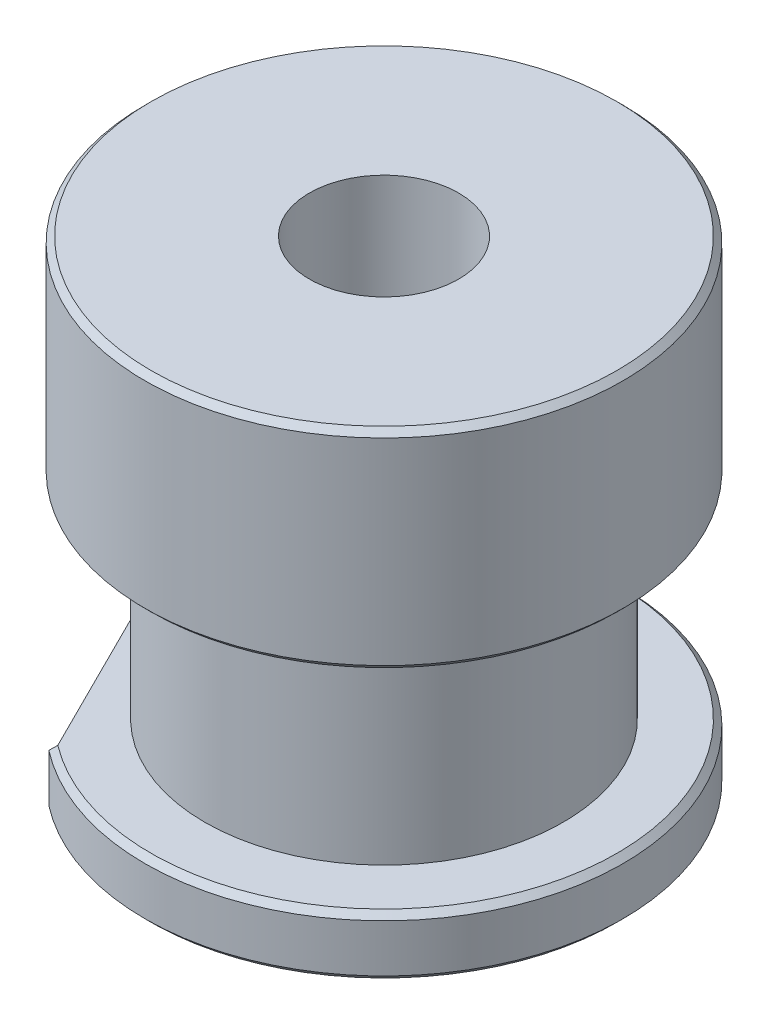
ISO-10303-21;
HEADER;
FILE_DESCRIPTION(('STEP AP214'),'2;1');
FILE_NAME('part.step','',(''),(''),'','','');
FILE_SCHEMA(('AUTOMOTIVE_DESIGN { 1 0 10303 214 1 1 1 1 }'));
ENDSEC;
DATA;
#1=APPLICATION_CONTEXT('core data for automotive mechanical design processes');
#2=APPLICATION_PROTOCOL_DEFINITION('international standard','automotive_design',2000,#1);
#3=PRODUCT_CONTEXT('',#1,'mechanical');
#4=PRODUCT('Part','Part','',(#3));
#5=PRODUCT_RELATED_PRODUCT_CATEGORY('part','',(#4));
#6=PRODUCT_DEFINITION_FORMATION('','',#4);
#7=PRODUCT_DEFINITION_CONTEXT('part definition',#1,'design');
#8=PRODUCT_DEFINITION('design','',#6,#7);
#9=PRODUCT_DEFINITION_SHAPE('','',#8);
#10=(LENGTH_UNIT() NAMED_UNIT(*) SI_UNIT(.MILLI.,.METRE.));
#11=(NAMED_UNIT(*) PLANE_ANGLE_UNIT() SI_UNIT($,.RADIAN.));
#12=(NAMED_UNIT(*) SI_UNIT($,.STERADIAN.) SOLID_ANGLE_UNIT());
#13=UNCERTAINTY_MEASURE_WITH_UNIT(LENGTH_MEASURE(1.E-05),#10,'distance_accuracy_value','');
#14=(GEOMETRIC_REPRESENTATION_CONTEXT(3) GLOBAL_UNCERTAINTY_ASSIGNED_CONTEXT((#13)) GLOBAL_UNIT_ASSIGNED_CONTEXT((#10,
#11,#12)) REPRESENTATION_CONTEXT('',''));
#15=CARTESIAN_POINT('',(0.,0.,0.));
#16=DIRECTION('',(0.,0.,1.));
#17=DIRECTION('',(1.,0.,0.));
#18=AXIS2_PLACEMENT_3D('',#15,#16,#17);
#19=CARTESIAN_POINT('',(0.,9.00000000000002,-3.55299123455666E-13));
#20=DIRECTION('',(0.,1.,-3.5615954629975E-13));
#21=DIRECTION('',(0.,3.5615954629975E-13,1.));
#22=AXIS2_PLACEMENT_3D('',#19,#20,#21);
#23=CYLINDRICAL_SURFACE('',#22,8.);
#24=CARTESIAN_POINT('',(0.,15.8,-2.77718403829397E-12));
#25=DIRECTION('',(0.,-1.,3.5615954629975E-13));
#26=DIRECTION('',(0.,-3.5615954629975E-13,-1.));
#27=AXIS2_PLACEMENT_3D('',#24,#25,#26);
#28=CIRCLE('',#27,8.);
#29=CARTESIAN_POINT('',(0.,15.7999999999972,-8.00000000000278));
#30=VERTEX_POINT('',#29);
#31=EDGE_CURVE('E162',#30,#30,#28,.T.);
#32=ORIENTED_EDGE('',*,*,#31,.T.);
#33=EDGE_LOOP('',(#32));
#34=FACE_BOUND('',#33,.T.);
#35=CARTESIAN_POINT('',(0.,9.20000000000003,-4.26531032715617E-13));
#36=DIRECTION('',(0.,-1.,3.5615954629975E-13));
#37=DIRECTION('',(0.,-3.5615954629975E-13,-1.));
#38=AXIS2_PLACEMENT_3D('',#35,#36,#37);
#39=CIRCLE('',#38,8.);
#40=CARTESIAN_POINT('',(0.,9.19999999999718,-8.00000000000043));
#41=VERTEX_POINT('',#40);
#42=EDGE_CURVE('E159',#41,#41,#39,.F.);
#43=ORIENTED_EDGE('',*,*,#42,.T.);
#44=EDGE_LOOP('',(#43));
#45=FACE_BOUND('',#44,.T.);
#46=ADVANCED_FACE('F36',(#34,#45),#23,.T.);
#47=CARTESIAN_POINT('',(0.,9.00000000000002,-3.55299123455666E-13));
#48=DIRECTION('',(0.,-1.,3.5615954629975E-13));
#49=DIRECTION('',(0.,-3.5615954629975E-13,-1.));
#50=AXIS2_PLACEMENT_3D('',#47,#48,#49);
#51=PLANE('',#50);
#52=CARTESIAN_POINT('',(0.,9.00000000000002,-3.55299123455666E-13));
#53=DIRECTION('',(0.,-1.,3.5615954629975E-13));
#54=DIRECTION('',(0.,-3.5615954629975E-13,-1.));
#55=AXIS2_PLACEMENT_3D('',#52,#53,#54);
#56=CIRCLE('',#55,7.79999999999999);
#57=CARTESIAN_POINT('',(0.,8.99999999999725,-7.80000000000035));
#58=VERTEX_POINT('',#57);
#59=EDGE_CURVE('E168',#58,#58,#56,.T.);
#60=ORIENTED_EDGE('',*,*,#59,.T.);
#61=EDGE_LOOP('',(#60));
#62=FACE_BOUND('',#61,.T.);
#63=CARTESIAN_POINT('',(0.,9.00000000000002,-3.55299123455666E-13));
#64=DIRECTION('',(0.,-1.,3.5615954629975E-13));
#65=DIRECTION('',(0.,-3.5615954629975E-13,-1.));
#66=AXIS2_PLACEMENT_3D('',#63,#64,#65);
#67=CIRCLE('',#66,6.);
#68=CARTESIAN_POINT('',(0.,8.99999999999789,-6.00000000000036));
#69=VERTEX_POINT('',#68);
#70=EDGE_CURVE('E156',#69,#69,#67,.T.);
#71=ORIENTED_EDGE('',*,*,#70,.F.);
#72=EDGE_LOOP('',(#71));
#73=FACE_BOUND('',#72,.T.);
#74=ADVANCED_FACE('F195',(#62,#73),#51,.T.);
#75=CARTESIAN_POINT('',(0.,16.,-2.84841594755392E-12));
#76=DIRECTION('',(0.,-1.,3.5615954629975E-13));
#77=DIRECTION('',(0.,-3.5615954629975E-13,-1.));
#78=AXIS2_PLACEMENT_3D('',#75,#76,#77);
#79=PLANE('',#78);
#80=CARTESIAN_POINT('',(0.,16.,-2.84841594755392E-12));
#81=DIRECTION('',(0.,-1.,3.5615954629975E-13));
#82=DIRECTION('',(0.,-3.5615954629975E-13,-1.));
#83=AXIS2_PLACEMENT_3D('',#80,#81,#82);
#84=CIRCLE('',#83,2.5);
#85=CARTESIAN_POINT('',(0.,15.9999999999991,-2.50000000000285));
#86=VERTEX_POINT('',#85);
#87=EDGE_CURVE('E150',#86,#86,#84,.T.);
#88=ORIENTED_EDGE('',*,*,#87,.T.);
#89=EDGE_LOOP('',(#88));
#90=FACE_BOUND('',#89,.T.);
#91=CARTESIAN_POINT('',(0.,16.,-2.84841594755392E-12));
#92=DIRECTION('',(0.,-1.,3.5615954629975E-13));
#93=DIRECTION('',(0.,-3.5615954629975E-13,-1.));
#94=AXIS2_PLACEMENT_3D('',#91,#92,#93);
#95=CIRCLE('',#94,7.80000000000001);
#96=CARTESIAN_POINT('',(0.,15.9999999999972,-7.80000000000286));
#97=VERTEX_POINT('',#96);
#98=EDGE_CURVE('E165',#97,#97,#95,.F.);
#99=ORIENTED_EDGE('',*,*,#98,.T.);
#100=EDGE_LOOP('',(#99));
#101=FACE_BOUND('',#100,.T.);
#102=ADVANCED_FACE('F191',(#90,#101),#79,.F.);
#103=CARTESIAN_POINT('',(0.,2.00000000000002,2.13781770064259E-12));
#104=DIRECTION('',(0.,1.,-3.5615954629975E-13));
#105=DIRECTION('',(0.,3.5615954629975E-13,1.));
#106=AXIS2_PLACEMENT_3D('',#103,#104,#105);
#107=CYLINDRICAL_SURFACE('',#106,6.);
#108=CARTESIAN_POINT('',(0.,2.00000000000002,2.13781770064259E-12));
#109=DIRECTION('',(0.,-1.,3.5615954629975E-13));
#110=DIRECTION('',(0.,-3.5615954629975E-13,-1.));
#111=AXIS2_PLACEMENT_3D('',#108,#109,#110);
#112=CIRCLE('',#111,6.);
#113=CARTESIAN_POINT('',(0.,1.99999999999789,-5.99999999999786));
#114=VERTEX_POINT('',#113);
#115=EDGE_CURVE('E153',#114,#114,#112,.T.);
#116=ORIENTED_EDGE('',*,*,#115,.F.);
#117=EDGE_LOOP('',(#116));
#118=FACE_BOUND('',#117,.T.);
#119=ORIENTED_EDGE('',*,*,#70,.T.);
#120=EDGE_LOOP('',(#119));
#121=FACE_BOUND('',#120,.T.);
#122=ADVANCED_FACE('F188',(#118,#121),#107,.T.);
#123=CARTESIAN_POINT('',(0.,0.,2.85013679324209E-12));
#124=DIRECTION('',(0.,1.,-3.5615954629975E-13));
#125=DIRECTION('',(0.,3.5615954629975E-13,1.));
#126=AXIS2_PLACEMENT_3D('',#123,#124,#125);
#127=CYLINDRICAL_SURFACE('',#126,8.);
#128=CARTESIAN_POINT('',(0.,1.80000000000002,2.20904960990254E-12));
#129=DIRECTION('',(0.,-1.,3.5615954629975E-13));
#130=DIRECTION('',(0.,-3.5615954629975E-13,-1.));
#131=AXIS2_PLACEMENT_3D('',#128,#129,#130);
#132=CIRCLE('',#131,8.);
#133=CARTESIAN_POINT('',(-7.99927615538211,1.80000000000006,0.107615007948586));
#134=VERTEX_POINT('',#133);
#135=CARTESIAN_POINT('',(-4.89865637582882,1.80000000000228,6.32480558686033));
#136=VERTEX_POINT('',#135);
#137=EDGE_CURVE('E105',#134,#136,#132,.T.);
#138=ORIENTED_EDGE('',*,*,#137,.T.);
#139=DIRECTION('',(0.,-1.,3.5615954629975E-13));
#140=VECTOR('',#139,1.);
#141=CARTESIAN_POINT('',(-4.89865637582882,1.50000000000225,6.32480558686044));
#142=LINE('',#141,#140);
#143=CARTESIAN_POINT('',(-4.89865637582882,0.200000000002283,6.3248055868609));
#144=VERTEX_POINT('',#143);
#145=EDGE_CURVE('E132',#136,#144,#142,.T.);
#146=ORIENTED_EDGE('',*,*,#145,.T.);
#147=CARTESIAN_POINT('',(0.,0.20000000000003,2.77890488398213E-12));
#148=DIRECTION('',(0.,-1.,3.5615954629975E-13));
#149=DIRECTION('',(0.,-3.5615954629975E-13,-1.));
#150=AXIS2_PLACEMENT_3D('',#147,#148,#149);
#151=CIRCLE('',#150,8.);
#152=CARTESIAN_POINT('',(-7.9992761553821,0.200000000000068,0.107615007949157));
#153=VERTEX_POINT('',#152);
#154=EDGE_CURVE('E171',#144,#153,#151,.F.);
#155=ORIENTED_EDGE('',*,*,#154,.T.);
#156=DIRECTION('',(0.,-1.,3.5615954629975E-13));
#157=VECTOR('',#156,1.);
#158=CARTESIAN_POINT('',(-7.9992761553821,1.50000000000004,0.107615007948693));
#159=LINE('',#158,#157);
#160=EDGE_CURVE('E85',#153,#134,#159,.F.);
#161=ORIENTED_EDGE('',*,*,#160,.T.);
#162=EDGE_LOOP('',(#138,#146,#155,#161));
#163=FACE_BOUND('',#162,.T.);
#164=ADVANCED_FACE('F176',(#163),#127,.T.);
#165=CARTESIAN_POINT('',(0.,0.,2.85013679324209E-12));
#166=DIRECTION('',(0.,-1.,3.5615954629975E-13));
#167=DIRECTION('',(0.,-3.5615954629975E-13,-1.));
#168=AXIS2_PLACEMENT_3D('',#165,#166,#167);
#169=PLANE('',#168);
#170=DIRECTION('',(0.44629498077672,3.18722159340823E-13,0.894885909003772));
#171=VECTOR('',#170,1.);
#172=CARTESIAN_POINT('',(-4.69280432608271,2.2190079596286E-12,6.2303761970795));
#173=LINE('',#172,#171);
#174=CARTESIAN_POINT('',(-7.8,0.,2.8501367932421E-12));
#175=VERTEX_POINT('',#174);
#176=CARTESIAN_POINT('',(-4.6928043260827,2.24329408829126E-12,6.23037619707951));
#177=VERTEX_POINT('',#176);
#178=EDGE_CURVE('E57',#175,#177,#173,.T.);
#179=ORIENTED_EDGE('',*,*,#178,.F.);
#180=CARTESIAN_POINT('',(0.,0.,2.85013679324209E-12));
#181=DIRECTION('',(0.,-1.,3.5615954629975E-13));
#182=DIRECTION('',(0.,-3.5615954629975E-13,-1.));
#183=AXIS2_PLACEMENT_3D('',#180,#181,#182);
#184=CIRCLE('',#183,7.79999999999999);
#185=EDGE_CURVE('E99',#175,#177,#184,.T.);
#186=ORIENTED_EDGE('',*,*,#185,.T.);
#187=EDGE_LOOP('',(#179,#186));
#188=FACE_BOUND('',#187,.T.);
#189=CARTESIAN_POINT('',(0.,0.,2.85013679324209E-12));
#190=DIRECTION('',(0.,-1.,3.5615954629975E-13));
#191=DIRECTION('',(0.,-3.5615954629975E-13,-1.));
#192=AXIS2_PLACEMENT_3D('',#189,#190,#191);
#193=CIRCLE('',#192,2.5);
#194=CARTESIAN_POINT('',(0.,-8.661127370857E-13,-2.49999999999715));
#195=VERTEX_POINT('',#194);
#196=EDGE_CURVE('E147',#195,#195,#193,.T.);
#197=ORIENTED_EDGE('',*,*,#196,.F.);
#198=EDGE_LOOP('',(#197));
#199=FACE_BOUND('',#198,.T.);
#200=ADVANCED_FACE('F97',(#188,#199),#169,.T.);
#201=CARTESIAN_POINT('',(0.,2.00000000000002,2.13781770064259E-12));
#202=DIRECTION('',(0.,-1.,3.5615954629975E-13));
#203=DIRECTION('',(0.,-3.5615954629975E-13,-1.));
#204=AXIS2_PLACEMENT_3D('',#201,#202,#203);
#205=PLANE('',#204);
#206=CARTESIAN_POINT('',(0.,2.00000000000002,2.13781770064259E-12));
#207=DIRECTION('',(0.,-1.,3.5615954629975E-13));
#208=DIRECTION('',(0.,-3.5615954629975E-13,-1.));
#209=AXIS2_PLACEMENT_3D('',#206,#207,#208);
#210=CIRCLE('',#209,7.8);
#211=CARTESIAN_POINT('',(-4.69280432608271,2.00000000000224,6.23037619707879));
#212=VERTEX_POINT('',#211);
#213=CARTESIAN_POINT('',(-7.8,2.00000000000003,2.13781770064259E-12));
#214=VERTEX_POINT('',#213);
#215=EDGE_CURVE('E102',#212,#214,#210,.F.);
#216=ORIENTED_EDGE('',*,*,#215,.T.);
#217=DIRECTION('',(0.44629498077672,3.18722159340823E-13,0.894885909003772));
#218=VECTOR('',#217,1.);
#219=CARTESIAN_POINT('',(-6.24640216304135,2.00000000000113,3.11518809854046));
#220=LINE('',#219,#218);
#221=EDGE_CURVE('E92',#214,#212,#220,.T.);
#222=ORIENTED_EDGE('',*,*,#221,.T.);
#223=EDGE_LOOP('',(#216,#222));
#224=FACE_BOUND('',#223,.T.);
#225=ORIENTED_EDGE('',*,*,#115,.T.);
#226=EDGE_LOOP('',(#225));
#227=FACE_BOUND('',#226,.T.);
#228=ADVANCED_FACE('F181',(#224,#227),#205,.F.);
#229=CARTESIAN_POINT('',(0.,15.8,-2.77718403829397E-12));
#230=DIRECTION('',(0.,-1.,3.5615954629975E-13));
#231=DIRECTION('',(0.,-3.5615954629975E-13,-1.));
#232=AXIS2_PLACEMENT_3D('',#229,#230,#231);
#233=CONICAL_SURFACE('',#232,8.,0.785398163397444);
#234=ORIENTED_EDGE('',*,*,#98,.F.);
#235=EDGE_LOOP('',(#234));
#236=FACE_BOUND('',#235,.T.);
#237=ORIENTED_EDGE('',*,*,#31,.F.);
#238=EDGE_LOOP('',(#237));
#239=FACE_BOUND('',#238,.T.);
#240=ADVANCED_FACE('F184',(#236,#239),#233,.T.);
#241=CARTESIAN_POINT('',(0.,9.00000000000002,-3.55299123455666E-13));
#242=DIRECTION('',(0.,1.,-3.5615954629975E-13));
#243=DIRECTION('',(0.,3.5615954629975E-13,1.));
#244=AXIS2_PLACEMENT_3D('',#241,#242,#243);
#245=CONICAL_SURFACE('',#244,7.79999999999999,0.785398163397453);
#246=ORIENTED_EDGE('',*,*,#42,.F.);
#247=EDGE_LOOP('',(#246));
#248=FACE_BOUND('',#247,.T.);
#249=ORIENTED_EDGE('',*,*,#59,.F.);
#250=EDGE_LOOP('',(#249));
#251=FACE_BOUND('',#250,.T.);
#252=ADVANCED_FACE('F138',(#248,#251),#245,.T.);
#253=CARTESIAN_POINT('',(0.,1.80000000000002,2.20904960990254E-12));
#254=DIRECTION('',(0.,-1.,3.5615954629975E-13));
#255=DIRECTION('',(0.,-3.5615954629975E-13,-1.));
#256=AXIS2_PLACEMENT_3D('',#253,#254,#255);
#257=CONICAL_SURFACE('',#256,8.,0.785398163397448);
#258=CARTESIAN_POINT('',(-7.79979999936512,2.00019999999725,-9.97357345741469E-05));
#259=CARTESIAN_POINT('',(-7.83346461907573,1.96654207687731,0.0166787725408074));
#260=CARTESIAN_POINT('',(-7.86693647972675,1.93301311595314,0.0340538946084994));
#261=CARTESIAN_POINT('',(-7.93349468546338,1.8662131159333,0.069997367707619));
#262=CARTESIAN_POINT('',(-7.96658103051941,1.83294207685742,0.0885657188306126));
#263=CARTESIAN_POINT('',(-7.99947461648626,1.7997999999971,0.107730683837482));
#264=B_SPLINE_CURVE_WITH_KNOTS('',3,(#258,#259,#260,#261,#262,#263),.UNSPECIFIED.,.F.,.F.,(4,2,
4),(0.,0.151387132500309,0.302774276617761),.UNSPECIFIED.);
#265=EDGE_CURVE('E65',#214,#134,#264,.T.);
#266=ORIENTED_EDGE('',*,*,#265,.F.);
#267=ORIENTED_EDGE('',*,*,#215,.F.);
#268=CARTESIAN_POINT('',(-4.89886817627148,1.79979999999718,6.32489451545431));
#269=CARTESIAN_POINT('',(-4.86376970035478,1.83294207780506,6.31015067088483));
#270=CARTESIAN_POINT('',(-4.82903180756834,1.86621311783564,6.29489390912543));
#271=CARTESIAN_POINT('',(-4.76027719089402,1.93301311977915,6.26335455243694));
#272=CARTESIAN_POINT('',(-4.72626046695081,1.9665420816723,6.24707195758657));
#273=CARTESIAN_POINT('',(-4.69260432608251,2.00020000576835,6.230276445625));
#274=B_SPLINE_CURVE_WITH_KNOTS('',3,(#268,#269,#270,#271,#272,#273),.UNSPECIFIED.,.F.,.F.,(4,2,
4),(0.,0.151387148444232,0.302774285271311),.UNSPECIFIED.);
#275=EDGE_CURVE('E125',#136,#212,#274,.T.);
#276=ORIENTED_EDGE('',*,*,#275,.F.);
#277=ORIENTED_EDGE('',*,*,#137,.F.);
#278=EDGE_LOOP('',(#266,#267,#276,#277));
#279=FACE_BOUND('',#278,.T.);
#280=ADVANCED_FACE('F134',(#279),#257,.T.);
#281=CARTESIAN_POINT('',(0.,0.,2.85013679324209E-12));
#282=DIRECTION('',(0.,1.,-3.5615954629975E-13));
#283=DIRECTION('',(0.,3.5615954629975E-13,1.));
#284=AXIS2_PLACEMENT_3D('',#281,#282,#283);
#285=CONICAL_SURFACE('',#284,7.79999999999999,0.785398163397448);
#286=CARTESIAN_POINT('',(-7.99947461648044,0.200199999997181,0.107730683835041));
#287=CARTESIAN_POINT('',(-7.96658103051409,0.167057923137363,0.0885657188284495));
#288=CARTESIAN_POINT('',(-7.93349468545858,0.133786884061985,0.0699973677057126));
#289=CARTESIAN_POINT('',(-7.86693647972299,0.0669868840431621,0.0340538946070645));
#290=CARTESIAN_POINT('',(-7.8334646190725,0.0334579231195088,0.0166787725395875));
#291=CARTESIAN_POINT('',(-7.79979999936242,-0.000199999999911317,-9.97357356005631E-05));
#292=B_SPLINE_CURVE_WITH_KNOTS('',3,(#286,#287,#288,#289,#290,#291),.UNSPECIFIED.,.F.,.F.,(4,2,
4),(0.,0.151387144115163,0.302774276613173),.UNSPECIFIED.);
#293=EDGE_CURVE('E11',#153,#175,#292,.T.);
#294=ORIENTED_EDGE('',*,*,#293,.F.);
#295=ORIENTED_EDGE('',*,*,#154,.F.);
#296=CARTESIAN_POINT('',(-4.69260432608271,-0.000200005763950957,6.23027644562542));
#297=CARTESIAN_POINT('',(-4.72626046694921,0.0334579183304139,6.2470719575862));
#298=CARTESIAN_POINT('',(-4.76027719089059,0.0669868802218825,6.26335455243583));
#299=CARTESIAN_POINT('',(-4.82903180756117,0.133786882162076,6.29489390912295));
#300=CARTESIAN_POINT('',(-4.8637697003457,0.167057922191008,6.31015067088171));
#301=CARTESIAN_POINT('',(-4.89886817626046,0.200199999997251,6.32489451545062));
#302=B_SPLINE_CURVE_WITH_KNOTS('',3,(#296,#297,#298,#299,#300,#301),.UNSPECIFIED.,.F.,.F.,(4,2,
4),(0.,0.151387136819315,0.302774285255773),.UNSPECIFIED.);
#303=EDGE_CURVE('E50',#177,#144,#302,.T.);
#304=ORIENTED_EDGE('',*,*,#303,.F.);
#305=ORIENTED_EDGE('',*,*,#185,.F.);
#306=EDGE_LOOP('',(#294,#295,#304,#305));
#307=FACE_BOUND('',#306,.T.);
#308=ADVANCED_FACE('F38',(#307),#285,.T.);
#309=CARTESIAN_POINT('',(0.,20.,-4.27305413275292E-12));
#310=DIRECTION('',(0.,-1.,3.5615954629975E-13));
#311=DIRECTION('',(0.,-3.5615954629975E-13,-1.));
#312=AXIS2_PLACEMENT_3D('',#309,#310,#311);
#313=CYLINDRICAL_SURFACE('',#312,2.5);
#314=ORIENTED_EDGE('',*,*,#196,.T.);
#315=EDGE_LOOP('',(#314));
#316=FACE_BOUND('',#315,.T.);
#317=ORIENTED_EDGE('',*,*,#87,.F.);
#318=EDGE_LOOP('',(#317));
#319=FACE_BOUND('',#318,.T.);
#320=ADVANCED_FACE('F118',(#316,#319),#313,.F.);
#321=CARTESIAN_POINT('',(-6.24640216304135,3.00000000000111,3.11518809854011));
#322=DIRECTION('',(0.,-1.,3.5615954629975E-13));
#323=DIRECTION('',(0.,-3.5615954629975E-13,-1.));
#324=AXIS2_PLACEMENT_3D('',#321,#322,#323);
#325=CYLINDRICAL_SURFACE('',#324,3.48110085005841);
#326=ORIENTED_EDGE('',*,*,#265,.T.);
#327=ORIENTED_EDGE('',*,*,#160,.F.);
#328=ORIENTED_EDGE('',*,*,#293,.T.);
#329=DIRECTION('',(0.,-1.,3.5615954629975E-13));
#330=VECTOR('',#329,1.);
#331=CARTESIAN_POINT('',(-7.8,3.,1.78165815434285E-12));
#332=LINE('',#331,#330);
#333=EDGE_CURVE('E84',#214,#175,#332,.T.);
#334=ORIENTED_EDGE('',*,*,#333,.F.);
#335=EDGE_LOOP('',(#326,#327,#328,#334));
#336=FACE_BOUND('',#335,.T.);
#337=ADVANCED_FACE('F83',(#336),#325,.F.);
#338=CARTESIAN_POINT('',(-4.69280432608271,3.00000000000222,6.23037619707843));
#339=DIRECTION('',(0.894885909003772,-1.58952217869293E-13,-0.44629498077672));
#340=DIRECTION('',(-0.44629498077672,0.,-0.894885909003772));
#341=AXIS2_PLACEMENT_3D('',#338,#339,#340);
#342=PLANE('',#341);
#343=ORIENTED_EDGE('',*,*,#333,.T.);
#344=ORIENTED_EDGE('',*,*,#178,.T.);
#345=DIRECTION('',(0.,-1.,3.5615954629975E-13));
#346=VECTOR('',#345,1.);
#347=CARTESIAN_POINT('',(-4.69280432608271,3.00000000000222,6.23037619707843));
#348=LINE('',#347,#346);
#349=EDGE_CURVE('E93',#212,#177,#348,.T.);
#350=ORIENTED_EDGE('',*,*,#349,.F.);
#351=ORIENTED_EDGE('',*,*,#221,.F.);
#352=EDGE_LOOP('',(#343,#344,#350,#351));
#353=FACE_BOUND('',#352,.T.);
#354=ADVANCED_FACE('F90',(#353),#342,.F.);
#355=ORIENTED_EDGE('',*,*,#275,.T.);
#356=ORIENTED_EDGE('',*,*,#349,.T.);
#357=ORIENTED_EDGE('',*,*,#303,.T.);
#358=ORIENTED_EDGE('',*,*,#145,.F.);
#359=EDGE_LOOP('',(#355,#356,#357,#358));
#360=FACE_BOUND('',#359,.T.);
#361=ADVANCED_FACE('F112',(#360),#325,.F.);
#362=CLOSED_SHELL('',(#46,#74,#102,#122,#164,#200,#228,#240,#252,#280,#308,#320,#337,#354,#361));
#363=MANIFOLD_SOLID_BREP('B2',#362);
#364=ADVANCED_BREP_SHAPE_REPRESENTATION('',(#18,#363),#14);
#365=SHAPE_DEFINITION_REPRESENTATION(#9,#364);
ENDSEC;
END-ISO-10303-21;
